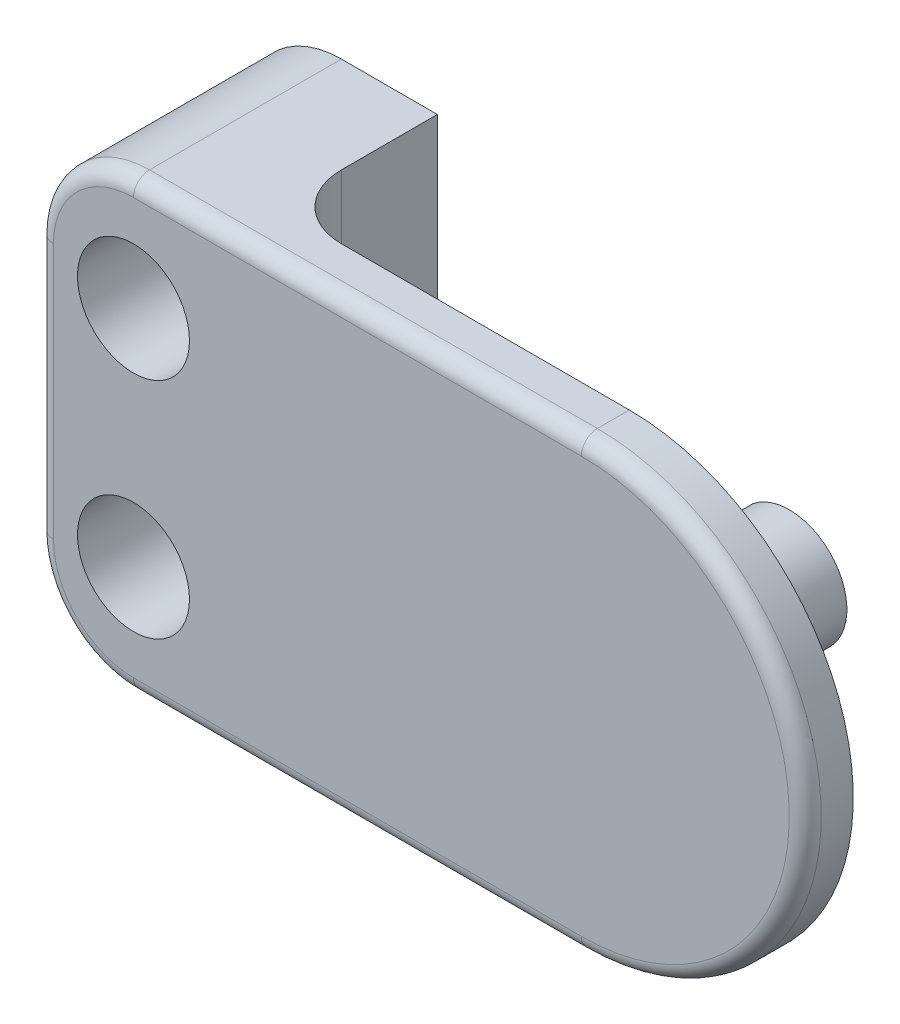
ISO-10303-21;
HEADER;
FILE_DESCRIPTION(('STEP AP214'),'2;1');
FILE_NAME('part.step','',(''),(''),'','','');
FILE_SCHEMA(('AUTOMOTIVE_DESIGN { 1 0 10303 214 1 1 1 1 }'));
ENDSEC;
DATA;
#1=APPLICATION_CONTEXT('core data for automotive mechanical design processes');
#2=APPLICATION_PROTOCOL_DEFINITION('international standard','automotive_design',2000,#1);
#3=PRODUCT_CONTEXT('',#1,'mechanical');
#4=PRODUCT('Part','Part','',(#3));
#5=PRODUCT_RELATED_PRODUCT_CATEGORY('part','',(#4));
#6=PRODUCT_DEFINITION_FORMATION('','',#4);
#7=PRODUCT_DEFINITION_CONTEXT('part definition',#1,'design');
#8=PRODUCT_DEFINITION('design','',#6,#7);
#9=PRODUCT_DEFINITION_SHAPE('','',#8);
#10=(LENGTH_UNIT() NAMED_UNIT(*) SI_UNIT(.MILLI.,.METRE.));
#11=(NAMED_UNIT(*) PLANE_ANGLE_UNIT() SI_UNIT($,.RADIAN.));
#12=(NAMED_UNIT(*) SI_UNIT($,.STERADIAN.) SOLID_ANGLE_UNIT());
#13=UNCERTAINTY_MEASURE_WITH_UNIT(LENGTH_MEASURE(1.E-05),#10,'distance_accuracy_value','');
#14=(GEOMETRIC_REPRESENTATION_CONTEXT(3) GLOBAL_UNCERTAINTY_ASSIGNED_CONTEXT((#13)) GLOBAL_UNIT_ASSIGNED_CONTEXT((#10,
#11,#12)) REPRESENTATION_CONTEXT('',''));
#15=CARTESIAN_POINT('',(0.,0.,0.));
#16=DIRECTION('',(0.,0.,1.));
#17=DIRECTION('',(1.,0.,0.));
#18=AXIS2_PLACEMENT_3D('',#15,#16,#17);
#19=CARTESIAN_POINT('',(-14.,3.5,1.5));
#20=DIRECTION('',(0.,0.,-1.));
#21=DIRECTION('',(-1.,0.,0.));
#22=AXIS2_PLACEMENT_3D('',#19,#20,#21);
#23=CYLINDRICAL_SURFACE('',#22,1.1);
#24=CARTESIAN_POINT('',(-14.,3.5,-5.));
#25=DIRECTION('',(0.,0.,-1.));
#26=DIRECTION('',(-1.,0.,0.));
#27=AXIS2_PLACEMENT_3D('',#24,#25,#26);
#28=CIRCLE('',#27,1.1);
#29=CARTESIAN_POINT('',(-15.1,3.5,-5.));
#30=VERTEX_POINT('',#29);
#31=EDGE_CURVE('E275',#30,#30,#28,.T.);
#32=ORIENTED_EDGE('',*,*,#31,.T.);
#33=EDGE_LOOP('',(#32));
#34=FACE_BOUND('',#33,.T.);
#35=CARTESIAN_POINT('',(-14.,3.5,-2.5));
#36=DIRECTION('',(0.,0.,1.));
#37=DIRECTION('',(1.,0.,0.));
#38=AXIS2_PLACEMENT_3D('',#35,#36,#37);
#39=CIRCLE('',#38,1.1);
#40=CARTESIAN_POINT('',(-12.9,3.5,-2.5));
#41=VERTEX_POINT('',#40);
#42=EDGE_CURVE('E241',#41,#41,#39,.T.);
#43=ORIENTED_EDGE('',*,*,#42,.T.);
#44=EDGE_LOOP('',(#43));
#45=FACE_BOUND('',#44,.T.);
#46=ADVANCED_FACE('F32',(#34,#45),#23,.F.);
#47=CARTESIAN_POINT('',(-14.,-3.5,1.5));
#48=DIRECTION('',(0.,0.,-1.));
#49=DIRECTION('',(-1.,0.,0.));
#50=AXIS2_PLACEMENT_3D('',#47,#48,#49);
#51=CYLINDRICAL_SURFACE('',#50,1.1);
#52=CARTESIAN_POINT('',(-14.,-3.5,-5.));
#53=DIRECTION('',(0.,0.,-1.));
#54=DIRECTION('',(-1.,0.,0.));
#55=AXIS2_PLACEMENT_3D('',#52,#53,#54);
#56=CIRCLE('',#55,1.1);
#57=CARTESIAN_POINT('',(-15.1,-3.5,-5.));
#58=VERTEX_POINT('',#57);
#59=EDGE_CURVE('E255',#58,#58,#56,.T.);
#60=ORIENTED_EDGE('',*,*,#59,.T.);
#61=EDGE_LOOP('',(#60));
#62=FACE_BOUND('',#61,.T.);
#63=CARTESIAN_POINT('',(-14.,-3.5,-2.5));
#64=DIRECTION('',(0.,0.,1.));
#65=DIRECTION('',(1.,0.,0.));
#66=AXIS2_PLACEMENT_3D('',#63,#64,#65);
#67=CIRCLE('',#66,1.1);
#68=CARTESIAN_POINT('',(-12.9,-3.5,-2.5));
#69=VERTEX_POINT('',#68);
#70=EDGE_CURVE('E256',#69,#69,#67,.T.);
#71=ORIENTED_EDGE('',*,*,#70,.T.);
#72=EDGE_LOOP('',(#71));
#73=FACE_BOUND('',#72,.T.);
#74=ADVANCED_FACE('F324',(#62,#73),#51,.F.);
#75=CARTESIAN_POINT('',(0.,0.,0.));
#76=DIRECTION('',(0.,0.,-1.));
#77=DIRECTION('',(-1.,0.,0.));
#78=AXIS2_PLACEMENT_3D('',#75,#76,#77);
#79=PLANE('',#78);
#80=CARTESIAN_POINT('',(0.,0.,0.));
#81=DIRECTION('',(0.,0.,-1.));
#82=DIRECTION('',(-1.,0.,0.));
#83=AXIS2_PLACEMENT_3D('',#80,#81,#82);
#84=CIRCLE('',#83,2.5);
#85=CARTESIAN_POINT('',(-2.5,0.,0.));
#86=VERTEX_POINT('',#85);
#87=EDGE_CURVE('E181',#86,#86,#84,.T.);
#88=ORIENTED_EDGE('',*,*,#87,.F.);
#89=EDGE_LOOP('',(#88));
#90=FACE_BOUND('',#89,.T.);
#91=DIRECTION('',(1.,0.,0.));
#92=VECTOR('',#91,1.);
#93=CARTESIAN_POINT('',(-17.,-7.,0.));
#94=LINE('',#93,#92);
#95=CARTESIAN_POINT('',(-9.,-7.,0.));
#96=VERTEX_POINT('',#95);
#97=CARTESIAN_POINT('',(0.,-7.,0.));
#98=VERTEX_POINT('',#97);
#99=EDGE_CURVE('E192',#96,#98,#94,.T.);
#100=ORIENTED_EDGE('',*,*,#99,.F.);
#101=DIRECTION('',(0.,-1.,0.));
#102=VECTOR('',#101,1.);
#103=CARTESIAN_POINT('',(-9.,0.,0.));
#104=LINE('',#103,#102);
#105=CARTESIAN_POINT('',(-9.,7.,0.));
#106=VERTEX_POINT('',#105);
#107=EDGE_CURVE('E47',#96,#106,#104,.F.);
#108=ORIENTED_EDGE('',*,*,#107,.T.);
#109=DIRECTION('',(-1.,0.,0.));
#110=VECTOR('',#109,1.);
#111=CARTESIAN_POINT('',(-17.,7.,0.));
#112=LINE('',#111,#110);
#113=CARTESIAN_POINT('',(0.,7.,0.));
#114=VERTEX_POINT('',#113);
#115=EDGE_CURVE('E190',#114,#106,#112,.T.);
#116=ORIENTED_EDGE('',*,*,#115,.F.);
#117=CARTESIAN_POINT('',(0.,0.,0.));
#118=DIRECTION('',(0.,0.,1.));
#119=DIRECTION('',(-1.,0.,0.));
#120=AXIS2_PLACEMENT_3D('',#117,#118,#119);
#121=CIRCLE('',#120,7.);
#122=EDGE_CURVE('E185',#98,#114,#121,.T.);
#123=ORIENTED_EDGE('',*,*,#122,.F.);
#124=EDGE_LOOP('',(#100,#108,#116,#123));
#125=FACE_BOUND('',#124,.T.);
#126=ADVANCED_FACE('F314',(#90,#125),#79,.T.);
#127=CARTESIAN_POINT('',(0.,0.,1.5));
#128=DIRECTION('',(0.,0.,-1.));
#129=DIRECTION('',(-1.,0.,0.));
#130=AXIS2_PLACEMENT_3D('',#127,#128,#129);
#131=PLANE('',#130);
#132=CARTESIAN_POINT('',(-14.,3.5,1.5));
#133=DIRECTION('',(0.,0.,1.));
#134=DIRECTION('',(1.,0.,0.));
#135=AXIS2_PLACEMENT_3D('',#132,#133,#134);
#136=CIRCLE('',#135,1.75);
#137=CARTESIAN_POINT('',(-12.25,3.5,1.5));
#138=VERTEX_POINT('',#137);
#139=EDGE_CURVE('E589',#138,#138,#136,.T.);
#140=ORIENTED_EDGE('',*,*,#139,.F.);
#141=EDGE_LOOP('',(#140));
#142=FACE_BOUND('',#141,.T.);
#143=CARTESIAN_POINT('',(-14.,-3.5,1.5));
#144=DIRECTION('',(0.,0.,1.));
#145=DIRECTION('',(1.,0.,0.));
#146=AXIS2_PLACEMENT_3D('',#143,#144,#145);
#147=CIRCLE('',#146,1.75);
#148=CARTESIAN_POINT('',(-12.25,-3.5,1.5));
#149=VERTEX_POINT('',#148);
#150=EDGE_CURVE('E594',#149,#149,#147,.T.);
#151=ORIENTED_EDGE('',*,*,#150,.F.);
#152=EDGE_LOOP('',(#151));
#153=FACE_BOUND('',#152,.T.);
#154=DIRECTION('',(1.,0.,0.));
#155=VECTOR('',#154,1.);
#156=CARTESIAN_POINT('',(0.,-6.5,1.5));
#157=LINE('',#156,#155);
#158=CARTESIAN_POINT('',(-14.,-6.5,1.5));
#159=VERTEX_POINT('',#158);
#160=CARTESIAN_POINT('',(0.,-6.5,1.5));
#161=VERTEX_POINT('',#160);
#162=EDGE_CURVE('E219',#159,#161,#157,.T.);
#163=ORIENTED_EDGE('',*,*,#162,.T.);
#164=CARTESIAN_POINT('',(0.,0.,1.5));
#165=DIRECTION('',(0.,0.,-1.));
#166=DIRECTION('',(-1.,0.,0.));
#167=AXIS2_PLACEMENT_3D('',#164,#165,#166);
#168=CIRCLE('',#167,6.5);
#169=CARTESIAN_POINT('',(0.,6.5,1.5));
#170=VERTEX_POINT('',#169);
#171=EDGE_CURVE('E221',#161,#170,#168,.F.);
#172=ORIENTED_EDGE('',*,*,#171,.T.);
#173=DIRECTION('',(-1.,0.,0.));
#174=VECTOR('',#173,1.);
#175=CARTESIAN_POINT('',(0.,6.5,1.5));
#176=LINE('',#175,#174);
#177=CARTESIAN_POINT('',(-14.,6.5,1.5));
#178=VERTEX_POINT('',#177);
#179=EDGE_CURVE('E211',#170,#178,#176,.T.);
#180=ORIENTED_EDGE('',*,*,#179,.T.);
#181=CARTESIAN_POINT('',(-14.,4.,1.5));
#182=DIRECTION('',(0.,0.,-1.));
#183=DIRECTION('',(-1.,0.,0.));
#184=AXIS2_PLACEMENT_3D('',#181,#182,#183);
#185=CIRCLE('',#184,2.5);
#186=CARTESIAN_POINT('',(-16.5,4.,1.5));
#187=VERTEX_POINT('',#186);
#188=EDGE_CURVE('E213',#178,#187,#185,.F.);
#189=ORIENTED_EDGE('',*,*,#188,.T.);
#190=DIRECTION('',(0.,-1.,0.));
#191=VECTOR('',#190,1.);
#192=CARTESIAN_POINT('',(-16.5,0.,1.5));
#193=LINE('',#192,#191);
#194=CARTESIAN_POINT('',(-16.5,-4.,1.5));
#195=VERTEX_POINT('',#194);
#196=EDGE_CURVE('E215',#187,#195,#193,.T.);
#197=ORIENTED_EDGE('',*,*,#196,.T.);
#198=CARTESIAN_POINT('',(-14.,-4.,1.5));
#199=DIRECTION('',(0.,0.,-1.));
#200=DIRECTION('',(-1.,0.,0.));
#201=AXIS2_PLACEMENT_3D('',#198,#199,#200);
#202=CIRCLE('',#201,2.5);
#203=EDGE_CURVE('E217',#195,#159,#202,.F.);
#204=ORIENTED_EDGE('',*,*,#203,.T.);
#205=EDGE_LOOP('',(#163,#172,#180,#189,#197,#204));
#206=FACE_BOUND('',#205,.T.);
#207=ADVANCED_FACE('F290',(#142,#153,#206),#131,.F.);
#208=CARTESIAN_POINT('',(0.,0.,1.5));
#209=DIRECTION('',(0.,0.,-1.));
#210=DIRECTION('',(-1.,0.,0.));
#211=AXIS2_PLACEMENT_3D('',#208,#209,#210);
#212=CYLINDRICAL_SURFACE('',#211,7.);
#213=DIRECTION('',(0.,0.,-1.));
#214=VECTOR('',#213,1.);
#215=CARTESIAN_POINT('',(0.,7.,1.5));
#216=LINE('',#215,#214);
#217=CARTESIAN_POINT('',(0.,7.,1.));
#218=VERTEX_POINT('',#217);
#219=EDGE_CURVE('E197',#218,#114,#216,.T.);
#220=ORIENTED_EDGE('',*,*,#219,.F.);
#221=CARTESIAN_POINT('',(0.,0.,1.));
#222=DIRECTION('',(0.,0.,-1.));
#223=DIRECTION('',(-1.,0.,0.));
#224=AXIS2_PLACEMENT_3D('',#221,#222,#223);
#225=CIRCLE('',#224,7.);
#226=CARTESIAN_POINT('',(0.,-7.,1.));
#227=VERTEX_POINT('',#226);
#228=EDGE_CURVE('E224',#218,#227,#225,.T.);
#229=ORIENTED_EDGE('',*,*,#228,.T.);
#230=DIRECTION('',(0.,0.,-1.));
#231=VECTOR('',#230,1.);
#232=CARTESIAN_POINT('',(0.,-7.,1.5));
#233=LINE('',#232,#231);
#234=EDGE_CURVE('E194',#227,#98,#233,.T.);
#235=ORIENTED_EDGE('',*,*,#234,.T.);
#236=ORIENTED_EDGE('',*,*,#122,.T.);
#237=EDGE_LOOP('',(#220,#229,#235,#236));
#238=FACE_BOUND('',#237,.T.);
#239=ADVANCED_FACE('F312',(#238),#212,.T.);
#240=CARTESIAN_POINT('',(-17.,7.,1.5));
#241=DIRECTION('',(0.,-1.,0.));
#242=DIRECTION('',(0.,0.,-1.));
#243=AXIS2_PLACEMENT_3D('',#240,#241,#242);
#244=PLANE('',#243);
#245=DIRECTION('',(0.,0.,-1.));
#246=VECTOR('',#245,1.);
#247=CARTESIAN_POINT('',(-14.,7.,1.5));
#248=LINE('',#247,#246);
#249=CARTESIAN_POINT('',(-14.,7.,-5.));
#250=VERTEX_POINT('',#249);
#251=CARTESIAN_POINT('',(-14.,7.,1.));
#252=VERTEX_POINT('',#251);
#253=EDGE_CURVE('E207',#250,#252,#248,.F.);
#254=ORIENTED_EDGE('',*,*,#253,.T.);
#255=DIRECTION('',(-1.,0.,0.));
#256=VECTOR('',#255,1.);
#257=CARTESIAN_POINT('',(-17.,7.,1.));
#258=LINE('',#257,#256);
#259=EDGE_CURVE('E235',#252,#218,#258,.F.);
#260=ORIENTED_EDGE('',*,*,#259,.T.);
#261=ORIENTED_EDGE('',*,*,#219,.T.);
#262=ORIENTED_EDGE('',*,*,#115,.T.);
#263=CARTESIAN_POINT('',(-9.,7.,-2.));
#264=DIRECTION('',(0.,-1.,0.));
#265=DIRECTION('',(0.,0.,-1.));
#266=AXIS2_PLACEMENT_3D('',#263,#264,#265);
#267=CIRCLE('',#266,2.);
#268=CARTESIAN_POINT('',(-11.,7.,-2.));
#269=VERTEX_POINT('',#268);
#270=EDGE_CURVE('E11',#106,#269,#267,.T.);
#271=ORIENTED_EDGE('',*,*,#270,.T.);
#272=DIRECTION('',(0.,0.,1.));
#273=VECTOR('',#272,1.);
#274=CARTESIAN_POINT('',(-11.,7.,-5.));
#275=LINE('',#274,#273);
#276=CARTESIAN_POINT('',(-11.,7.,-5.));
#277=VERTEX_POINT('',#276);
#278=EDGE_CURVE('E148',#277,#269,#275,.T.);
#279=ORIENTED_EDGE('',*,*,#278,.F.);
#280=DIRECTION('',(1.,0.,0.));
#281=VECTOR('',#280,1.);
#282=CARTESIAN_POINT('',(-17.,7.,-5.));
#283=LINE('',#282,#281);
#284=EDGE_CURVE('E131',#250,#277,#283,.T.);
#285=ORIENTED_EDGE('',*,*,#284,.F.);
#286=EDGE_LOOP('',(#254,#260,#261,#262,#271,#279,#285));
#287=FACE_BOUND('',#286,.T.);
#288=ADVANCED_FACE('F149',(#287),#244,.F.);
#289=CARTESIAN_POINT('',(-17.,7.,1.5));
#290=DIRECTION('',(1.,0.,0.));
#291=DIRECTION('',(0.,1.,0.));
#292=AXIS2_PLACEMENT_3D('',#289,#290,#291);
#293=PLANE('',#292);
#294=DIRECTION('',(0.,0.,-1.));
#295=VECTOR('',#294,1.);
#296=CARTESIAN_POINT('',(-17.,-4.,1.5));
#297=LINE('',#296,#295);
#298=CARTESIAN_POINT('',(-17.,-4.,-5.));
#299=VERTEX_POINT('',#298);
#300=CARTESIAN_POINT('',(-17.,-4.,1.));
#301=VERTEX_POINT('',#300);
#302=EDGE_CURVE('E199',#299,#301,#297,.F.);
#303=ORIENTED_EDGE('',*,*,#302,.T.);
#304=DIRECTION('',(0.,-1.,0.));
#305=VECTOR('',#304,1.);
#306=CARTESIAN_POINT('',(-17.,7.,1.));
#307=LINE('',#306,#305);
#308=CARTESIAN_POINT('',(-17.,4.,1.));
#309=VERTEX_POINT('',#308);
#310=EDGE_CURVE('E231',#301,#309,#307,.F.);
#311=ORIENTED_EDGE('',*,*,#310,.T.);
#312=DIRECTION('',(0.,0.,-1.));
#313=VECTOR('',#312,1.);
#314=CARTESIAN_POINT('',(-17.,4.,1.5));
#315=LINE('',#314,#313);
#316=CARTESIAN_POINT('',(-17.,4.,-5.));
#317=VERTEX_POINT('',#316);
#318=EDGE_CURVE('E202',#309,#317,#315,.T.);
#319=ORIENTED_EDGE('',*,*,#318,.T.);
#320=DIRECTION('',(0.,1.,0.));
#321=VECTOR('',#320,1.);
#322=CARTESIAN_POINT('',(-17.,7.,-5.));
#323=LINE('',#322,#321);
#324=EDGE_CURVE('E145',#299,#317,#323,.T.);
#325=ORIENTED_EDGE('',*,*,#324,.F.);
#326=EDGE_LOOP('',(#303,#311,#319,#325));
#327=FACE_BOUND('',#326,.T.);
#328=ADVANCED_FACE('F272',(#327),#293,.F.);
#329=CARTESIAN_POINT('',(-17.,-7.,1.5));
#330=DIRECTION('',(0.,1.,0.));
#331=DIRECTION('',(0.,0.,1.));
#332=AXIS2_PLACEMENT_3D('',#329,#330,#331);
#333=PLANE('',#332);
#334=ORIENTED_EDGE('',*,*,#234,.F.);
#335=DIRECTION('',(1.,0.,0.));
#336=VECTOR('',#335,1.);
#337=CARTESIAN_POINT('',(-17.,-7.,1.));
#338=LINE('',#337,#336);
#339=CARTESIAN_POINT('',(-14.,-7.,1.));
#340=VERTEX_POINT('',#339);
#341=EDGE_CURVE('E227',#227,#340,#338,.F.);
#342=ORIENTED_EDGE('',*,*,#341,.T.);
#343=DIRECTION('',(0.,0.,-1.));
#344=VECTOR('',#343,1.);
#345=CARTESIAN_POINT('',(-14.,-7.,1.5));
#346=LINE('',#345,#344);
#347=CARTESIAN_POINT('',(-14.,-7.,-5.));
#348=VERTEX_POINT('',#347);
#349=EDGE_CURVE('E209',#340,#348,#346,.T.);
#350=ORIENTED_EDGE('',*,*,#349,.T.);
#351=DIRECTION('',(-1.,0.,0.));
#352=VECTOR('',#351,1.);
#353=CARTESIAN_POINT('',(-17.,-7.,-5.));
#354=LINE('',#353,#352);
#355=CARTESIAN_POINT('',(-11.,-7.,-5.));
#356=VERTEX_POINT('',#355);
#357=EDGE_CURVE('E159',#356,#348,#354,.T.);
#358=ORIENTED_EDGE('',*,*,#357,.F.);
#359=DIRECTION('',(0.,0.,1.));
#360=VECTOR('',#359,1.);
#361=CARTESIAN_POINT('',(-11.,-7.,-5.));
#362=LINE('',#361,#360);
#363=CARTESIAN_POINT('',(-11.,-7.,-2.));
#364=VERTEX_POINT('',#363);
#365=EDGE_CURVE('E155',#356,#364,#362,.T.);
#366=ORIENTED_EDGE('',*,*,#365,.T.);
#367=CARTESIAN_POINT('',(-9.,-7.,-2.));
#368=DIRECTION('',(0.,1.,0.));
#369=DIRECTION('',(0.,0.,1.));
#370=AXIS2_PLACEMENT_3D('',#367,#368,#369);
#371=CIRCLE('',#370,2.);
#372=EDGE_CURVE('E40',#364,#96,#371,.T.);
#373=ORIENTED_EDGE('',*,*,#372,.T.);
#374=ORIENTED_EDGE('',*,*,#99,.T.);
#375=EDGE_LOOP('',(#334,#342,#350,#358,#366,#373,#374));
#376=FACE_BOUND('',#375,.T.);
#377=ADVANCED_FACE('F265',(#376),#333,.F.);
#378=CARTESIAN_POINT('',(0.,0.,-1.));
#379=DIRECTION('',(0.,0.,1.));
#380=DIRECTION('',(1.,0.,0.));
#381=AXIS2_PLACEMENT_3D('',#378,#379,#380);
#382=CYLINDRICAL_SURFACE('',#381,2.5);
#383=CARTESIAN_POINT('',(0.,0.,-1.));
#384=DIRECTION('',(0.,0.,-1.));
#385=DIRECTION('',(-1.,0.,0.));
#386=AXIS2_PLACEMENT_3D('',#383,#384,#385);
#387=CIRCLE('',#386,2.5);
#388=CARTESIAN_POINT('',(-2.5,0.,-1.));
#389=VERTEX_POINT('',#388);
#390=EDGE_CURVE('E182',#389,#389,#387,.T.);
#391=ORIENTED_EDGE('',*,*,#390,.F.);
#392=EDGE_LOOP('',(#391));
#393=FACE_BOUND('',#392,.T.);
#394=ORIENTED_EDGE('',*,*,#87,.T.);
#395=EDGE_LOOP('',(#394));
#396=FACE_BOUND('',#395,.T.);
#397=ADVANCED_FACE('F344',(#393,#396),#382,.T.);
#398=CARTESIAN_POINT('',(0.,0.,-1.));
#399=DIRECTION('',(0.,0.,-1.));
#400=DIRECTION('',(-1.,0.,0.));
#401=AXIS2_PLACEMENT_3D('',#398,#399,#400);
#402=PLANE('',#401);
#403=CARTESIAN_POINT('',(0.,0.,-1.));
#404=DIRECTION('',(0.,0.,-1.));
#405=DIRECTION('',(-1.,0.,0.));
#406=AXIS2_PLACEMENT_3D('',#403,#404,#405);
#407=CIRCLE('',#406,1.8);
#408=CARTESIAN_POINT('',(-1.13862177025649,1.39410920099466,-1.));
#409=VERTEX_POINT('',#408);
#410=CARTESIAN_POINT('',(-1.13862177025649,-1.39410920099466,-1.));
#411=VERTEX_POINT('',#410);
#412=EDGE_CURVE('E154',#409,#411,#407,.T.);
#413=ORIENTED_EDGE('',*,*,#412,.F.);
#414=DIRECTION('',(0.,1.,0.));
#415=VECTOR('',#414,1.);
#416=CARTESIAN_POINT('',(-1.13862177025649,1.39410920099466,-1.));
#417=LINE('',#416,#415);
#418=EDGE_CURVE('E169',#411,#409,#417,.T.);
#419=ORIENTED_EDGE('',*,*,#418,.F.);
#420=EDGE_LOOP('',(#413,#419));
#421=FACE_BOUND('',#420,.T.);
#422=ORIENTED_EDGE('',*,*,#390,.T.);
#423=EDGE_LOOP('',(#422));
#424=FACE_BOUND('',#423,.T.);
#425=ADVANCED_FACE('F546',(#421,#424),#402,.T.);
#426=CARTESIAN_POINT('',(0.,0.,-5.));
#427=DIRECTION('',(0.,0.,1.));
#428=DIRECTION('',(1.,0.,0.));
#429=AXIS2_PLACEMENT_3D('',#426,#427,#428);
#430=CYLINDRICAL_SURFACE('',#429,1.8);
#431=ORIENTED_EDGE('',*,*,#412,.T.);
#432=DIRECTION('',(0.,0.,1.));
#433=VECTOR('',#432,1.);
#434=CARTESIAN_POINT('',(-1.13862177025649,-1.39410920099466,-5.));
#435=LINE('',#434,#433);
#436=CARTESIAN_POINT('',(-1.13862177025649,-1.39410920099466,-5.));
#437=VERTEX_POINT('',#436);
#438=EDGE_CURVE('E178',#437,#411,#435,.T.);
#439=ORIENTED_EDGE('',*,*,#438,.F.);
#440=CARTESIAN_POINT('',(0.,0.,-5.));
#441=DIRECTION('',(0.,0.,-1.));
#442=DIRECTION('',(-1.,0.,0.));
#443=AXIS2_PLACEMENT_3D('',#440,#441,#442);
#444=CIRCLE('',#443,1.8);
#445=CARTESIAN_POINT('',(-1.13862177025649,1.39410920099466,-5.));
#446=VERTEX_POINT('',#445);
#447=EDGE_CURVE('E165',#446,#437,#444,.T.);
#448=ORIENTED_EDGE('',*,*,#447,.F.);
#449=DIRECTION('',(0.,0.,1.));
#450=VECTOR('',#449,1.);
#451=CARTESIAN_POINT('',(-1.13862177025649,1.39410920099466,-5.));
#452=LINE('',#451,#450);
#453=EDGE_CURVE('E171',#446,#409,#452,.T.);
#454=ORIENTED_EDGE('',*,*,#453,.T.);
#455=EDGE_LOOP('',(#431,#439,#448,#454));
#456=FACE_BOUND('',#455,.T.);
#457=ADVANCED_FACE('F536',(#456),#430,.T.);
#458=CARTESIAN_POINT('',(-1.13862177025649,1.39410920099466,-5.));
#459=DIRECTION('',(1.,0.,0.));
#460=DIRECTION('',(0.,0.,-1.));
#461=AXIS2_PLACEMENT_3D('',#458,#459,#460);
#462=PLANE('',#461);
#463=ORIENTED_EDGE('',*,*,#418,.T.);
#464=ORIENTED_EDGE('',*,*,#453,.F.);
#465=DIRECTION('',(0.,1.,0.));
#466=VECTOR('',#465,1.);
#467=CARTESIAN_POINT('',(-1.13862177025649,1.39410920099466,-5.));
#468=LINE('',#467,#466);
#469=EDGE_CURVE('E168',#437,#446,#468,.T.);
#470=ORIENTED_EDGE('',*,*,#469,.F.);
#471=ORIENTED_EDGE('',*,*,#438,.T.);
#472=EDGE_LOOP('',(#463,#464,#470,#471));
#473=FACE_BOUND('',#472,.T.);
#474=ADVANCED_FACE('F526',(#473),#462,.F.);
#475=CARTESIAN_POINT('',(0.,0.,-5.));
#476=DIRECTION('',(0.,0.,-1.));
#477=DIRECTION('',(-1.,0.,0.));
#478=AXIS2_PLACEMENT_3D('',#475,#476,#477);
#479=PLANE('',#478);
#480=ORIENTED_EDGE('',*,*,#447,.T.);
#481=ORIENTED_EDGE('',*,*,#469,.T.);
#482=EDGE_LOOP('',(#480,#481));
#483=FACE_BOUND('',#482,.T.);
#484=ADVANCED_FACE('F520',(#483),#479,.T.);
#485=CARTESIAN_POINT('',(0.,0.,-5.));
#486=DIRECTION('',(0.,0.,1.));
#487=DIRECTION('',(1.,0.,0.));
#488=AXIS2_PLACEMENT_3D('',#485,#486,#487);
#489=PLANE('',#488);
#490=ORIENTED_EDGE('',*,*,#324,.T.);
#491=CARTESIAN_POINT('',(-14.,4.,-5.));
#492=DIRECTION('',(0.,0.,1.));
#493=DIRECTION('',(1.,0.,0.));
#494=AXIS2_PLACEMENT_3D('',#491,#492,#493);
#495=CIRCLE('',#494,3.);
#496=EDGE_CURVE('E141',#317,#250,#495,.F.);
#497=ORIENTED_EDGE('',*,*,#496,.T.);
#498=ORIENTED_EDGE('',*,*,#284,.T.);
#499=DIRECTION('',(0.,-1.,0.));
#500=VECTOR('',#499,1.);
#501=CARTESIAN_POINT('',(-11.,7.,-5.));
#502=LINE('',#501,#500);
#503=EDGE_CURVE('E138',#277,#356,#502,.T.);
#504=ORIENTED_EDGE('',*,*,#503,.T.);
#505=ORIENTED_EDGE('',*,*,#357,.T.);
#506=CARTESIAN_POINT('',(-14.,-4.,-5.));
#507=DIRECTION('',(0.,0.,1.));
#508=DIRECTION('',(1.,0.,0.));
#509=AXIS2_PLACEMENT_3D('',#506,#507,#508);
#510=CIRCLE('',#509,3.);
#511=EDGE_CURVE('E204',#348,#299,#510,.F.);
#512=ORIENTED_EDGE('',*,*,#511,.T.);
#513=EDGE_LOOP('',(#490,#497,#498,#504,#505,#512));
#514=FACE_BOUND('',#513,.T.);
#515=ORIENTED_EDGE('',*,*,#31,.F.);
#516=EDGE_LOOP('',(#515));
#517=FACE_BOUND('',#516,.T.);
#518=ORIENTED_EDGE('',*,*,#59,.F.);
#519=EDGE_LOOP('',(#518));
#520=FACE_BOUND('',#519,.T.);
#521=ADVANCED_FACE('F134',(#514,#517,#520),#489,.F.);
#522=CARTESIAN_POINT('',(-11.,7.,-5.));
#523=DIRECTION('',(-1.,0.,0.));
#524=DIRECTION('',(0.,-1.,0.));
#525=AXIS2_PLACEMENT_3D('',#522,#523,#524);
#526=PLANE('',#525);
#527=ORIENTED_EDGE('',*,*,#278,.T.);
#528=DIRECTION('',(0.,-1.,0.));
#529=VECTOR('',#528,1.);
#530=CARTESIAN_POINT('',(-11.,7.,-2.));
#531=LINE('',#530,#529);
#532=EDGE_CURVE('E237',#269,#364,#531,.T.);
#533=ORIENTED_EDGE('',*,*,#532,.T.);
#534=ORIENTED_EDGE('',*,*,#365,.F.);
#535=ORIENTED_EDGE('',*,*,#503,.F.);
#536=EDGE_LOOP('',(#527,#533,#534,#535));
#537=FACE_BOUND('',#536,.T.);
#538=ADVANCED_FACE('F157',(#537),#526,.F.);
#539=CARTESIAN_POINT('',(-14.,4.,1.5));
#540=DIRECTION('',(0.,0.,-1.));
#541=DIRECTION('',(-1.,0.,0.));
#542=AXIS2_PLACEMENT_3D('',#539,#540,#541);
#543=CYLINDRICAL_SURFACE('',#542,3.);
#544=ORIENTED_EDGE('',*,*,#318,.F.);
#545=CARTESIAN_POINT('',(-14.,4.,1.));
#546=DIRECTION('',(0.,0.,-1.));
#547=DIRECTION('',(-1.,0.,0.));
#548=AXIS2_PLACEMENT_3D('',#545,#546,#547);
#549=CIRCLE('',#548,3.);
#550=EDGE_CURVE('E233',#309,#252,#549,.T.);
#551=ORIENTED_EDGE('',*,*,#550,.T.);
#552=ORIENTED_EDGE('',*,*,#253,.F.);
#553=ORIENTED_EDGE('',*,*,#496,.F.);
#554=EDGE_LOOP('',(#544,#551,#552,#553));
#555=FACE_BOUND('',#554,.T.);
#556=ADVANCED_FACE('F298',(#555),#543,.T.);
#557=CARTESIAN_POINT('',(-14.,-4.,1.5));
#558=DIRECTION('',(0.,0.,-1.));
#559=DIRECTION('',(-1.,0.,0.));
#560=AXIS2_PLACEMENT_3D('',#557,#558,#559);
#561=CYLINDRICAL_SURFACE('',#560,3.);
#562=ORIENTED_EDGE('',*,*,#349,.F.);
#563=CARTESIAN_POINT('',(-14.,-4.,1.));
#564=DIRECTION('',(0.,0.,-1.));
#565=DIRECTION('',(-1.,0.,0.));
#566=AXIS2_PLACEMENT_3D('',#563,#564,#565);
#567=CIRCLE('',#566,3.);
#568=EDGE_CURVE('E229',#340,#301,#567,.T.);
#569=ORIENTED_EDGE('',*,*,#568,.T.);
#570=ORIENTED_EDGE('',*,*,#302,.F.);
#571=ORIENTED_EDGE('',*,*,#511,.F.);
#572=EDGE_LOOP('',(#562,#569,#570,#571));
#573=FACE_BOUND('',#572,.T.);
#574=ADVANCED_FACE('F276',(#573),#561,.T.);
#575=CARTESIAN_POINT('',(-16.5,0.,1.));
#576=DIRECTION('',(0.,-1.,0.));
#577=DIRECTION('',(1.,0.,0.));
#578=AXIS2_PLACEMENT_3D('',#575,#576,#577);
#579=CYLINDRICAL_SURFACE('',#578,0.5);
#580=CARTESIAN_POINT('',(-16.5,4.,1.));
#581=DIRECTION('',(0.,1.,0.));
#582=DIRECTION('',(0.,0.,1.));
#583=AXIS2_PLACEMENT_3D('',#580,#581,#582);
#584=CIRCLE('',#583,0.5);
#585=EDGE_CURVE('E249',#309,#187,#584,.T.);
#586=ORIENTED_EDGE('',*,*,#585,.F.);
#587=ORIENTED_EDGE('',*,*,#310,.F.);
#588=CARTESIAN_POINT('',(-16.5,-4.,1.));
#589=DIRECTION('',(0.,-1.,0.));
#590=DIRECTION('',(0.,0.,-1.));
#591=AXIS2_PLACEMENT_3D('',#588,#589,#590);
#592=CIRCLE('',#591,0.5);
#593=EDGE_CURVE('E252',#195,#301,#592,.T.);
#594=ORIENTED_EDGE('',*,*,#593,.F.);
#595=ORIENTED_EDGE('',*,*,#196,.F.);
#596=EDGE_LOOP('',(#586,#587,#594,#595));
#597=FACE_BOUND('',#596,.T.);
#598=ADVANCED_FACE('F295',(#597),#579,.T.);
#599=CARTESIAN_POINT('',(-14.,-4.,1.));
#600=DIRECTION('',(0.,0.,-1.));
#601=DIRECTION('',(-1.,0.,0.));
#602=AXIS2_PLACEMENT_3D('',#599,#600,#601);
#603=TOROIDAL_SURFACE('',#602,2.5,0.5);
#604=ORIENTED_EDGE('',*,*,#593,.T.);
#605=ORIENTED_EDGE('',*,*,#568,.F.);
#606=CARTESIAN_POINT('',(-14.,-6.5,1.));
#607=DIRECTION('',(1.,0.,0.));
#608=DIRECTION('',(0.,0.,-1.));
#609=AXIS2_PLACEMENT_3D('',#606,#607,#608);
#610=CIRCLE('',#609,0.5);
#611=EDGE_CURVE('E246',#159,#340,#610,.T.);
#612=ORIENTED_EDGE('',*,*,#611,.F.);
#613=ORIENTED_EDGE('',*,*,#203,.F.);
#614=EDGE_LOOP('',(#604,#605,#612,#613));
#615=FACE_BOUND('',#614,.T.);
#616=ADVANCED_FACE('F280',(#615),#603,.T.);
#617=CARTESIAN_POINT('',(-14.,4.,1.));
#618=DIRECTION('',(0.,0.,-1.));
#619=DIRECTION('',(-1.,0.,0.));
#620=AXIS2_PLACEMENT_3D('',#617,#618,#619);
#621=TOROIDAL_SURFACE('',#620,2.5,0.5);
#622=ORIENTED_EDGE('',*,*,#585,.T.);
#623=ORIENTED_EDGE('',*,*,#188,.F.);
#624=CARTESIAN_POINT('',(-14.,6.5,1.));
#625=DIRECTION('',(1.,0.,0.));
#626=DIRECTION('',(0.,0.,-1.));
#627=AXIS2_PLACEMENT_3D('',#624,#625,#626);
#628=CIRCLE('',#627,0.5);
#629=EDGE_CURVE('E243',#252,#178,#628,.T.);
#630=ORIENTED_EDGE('',*,*,#629,.F.);
#631=ORIENTED_EDGE('',*,*,#550,.F.);
#632=EDGE_LOOP('',(#622,#623,#630,#631));
#633=FACE_BOUND('',#632,.T.);
#634=ADVANCED_FACE('F303',(#633),#621,.T.);
#635=CARTESIAN_POINT('',(0.,-6.5,1.));
#636=DIRECTION('',(1.,0.,0.));
#637=DIRECTION('',(0.,0.,-1.));
#638=AXIS2_PLACEMENT_3D('',#635,#636,#637);
#639=CYLINDRICAL_SURFACE('',#638,0.5);
#640=ORIENTED_EDGE('',*,*,#611,.T.);
#641=ORIENTED_EDGE('',*,*,#341,.F.);
#642=CARTESIAN_POINT('',(0.,-6.5,1.));
#643=DIRECTION('',(1.,0.,0.));
#644=DIRECTION('',(0.,0.,-1.));
#645=AXIS2_PLACEMENT_3D('',#642,#643,#644);
#646=CIRCLE('',#645,0.5);
#647=EDGE_CURVE('E240',#161,#227,#646,.T.);
#648=ORIENTED_EDGE('',*,*,#647,.F.);
#649=ORIENTED_EDGE('',*,*,#162,.F.);
#650=EDGE_LOOP('',(#640,#641,#648,#649));
#651=FACE_BOUND('',#650,.T.);
#652=ADVANCED_FACE('F286',(#651),#639,.T.);
#653=CARTESIAN_POINT('',(0.,6.5,1.));
#654=DIRECTION('',(-1.,0.,0.));
#655=DIRECTION('',(0.,0.,1.));
#656=AXIS2_PLACEMENT_3D('',#653,#654,#655);
#657=CYLINDRICAL_SURFACE('',#656,0.5);
#658=ORIENTED_EDGE('',*,*,#629,.T.);
#659=ORIENTED_EDGE('',*,*,#179,.F.);
#660=CARTESIAN_POINT('',(0.,6.5,1.));
#661=DIRECTION('',(1.,0.,0.));
#662=DIRECTION('',(0.,0.,-1.));
#663=AXIS2_PLACEMENT_3D('',#660,#661,#662);
#664=CIRCLE('',#663,0.5);
#665=EDGE_CURVE('E238',#218,#170,#664,.T.);
#666=ORIENTED_EDGE('',*,*,#665,.F.);
#667=ORIENTED_EDGE('',*,*,#259,.F.);
#668=EDGE_LOOP('',(#658,#659,#666,#667));
#669=FACE_BOUND('',#668,.T.);
#670=ADVANCED_FACE('F307',(#669),#657,.T.);
#671=CARTESIAN_POINT('',(0.,0.,1.));
#672=DIRECTION('',(0.,0.,-1.));
#673=DIRECTION('',(-1.,0.,0.));
#674=AXIS2_PLACEMENT_3D('',#671,#672,#673);
#675=TOROIDAL_SURFACE('',#674,6.5,0.5);
#676=ORIENTED_EDGE('',*,*,#647,.T.);
#677=ORIENTED_EDGE('',*,*,#228,.F.);
#678=ORIENTED_EDGE('',*,*,#665,.T.);
#679=ORIENTED_EDGE('',*,*,#171,.F.);
#680=EDGE_LOOP('',(#676,#677,#678,#679));
#681=FACE_BOUND('',#680,.T.);
#682=ADVANCED_FACE('F310',(#681),#675,.T.);
#683=CARTESIAN_POINT('',(-14.,-3.5,-2.5));
#684=DIRECTION('',(0.,0.,1.));
#685=DIRECTION('',(1.,0.,0.));
#686=AXIS2_PLACEMENT_3D('',#683,#684,#685);
#687=CYLINDRICAL_SURFACE('',#686,1.75);
#688=CARTESIAN_POINT('',(-14.,-3.5,-2.5));
#689=DIRECTION('',(0.,0.,1.));
#690=DIRECTION('',(1.,0.,0.));
#691=AXIS2_PLACEMENT_3D('',#688,#689,#690);
#692=CIRCLE('',#691,1.75);
#693=CARTESIAN_POINT('',(-12.25,-3.5,-2.5));
#694=VERTEX_POINT('',#693);
#695=EDGE_CURVE('E590',#694,#694,#692,.T.);
#696=ORIENTED_EDGE('',*,*,#695,.F.);
#697=EDGE_LOOP('',(#696));
#698=FACE_BOUND('',#697,.T.);
#699=ORIENTED_EDGE('',*,*,#150,.T.);
#700=EDGE_LOOP('',(#699));
#701=FACE_BOUND('',#700,.T.);
#702=ADVANCED_FACE('F357',(#698,#701),#687,.F.);
#703=CARTESIAN_POINT('',(-14.,-3.5,-2.5));
#704=DIRECTION('',(0.,0.,1.));
#705=DIRECTION('',(1.,0.,0.));
#706=AXIS2_PLACEMENT_3D('',#703,#704,#705);
#707=PLANE('',#706);
#708=ORIENTED_EDGE('',*,*,#70,.F.);
#709=EDGE_LOOP('',(#708));
#710=FACE_BOUND('',#709,.T.);
#711=ORIENTED_EDGE('',*,*,#695,.T.);
#712=EDGE_LOOP('',(#711));
#713=FACE_BOUND('',#712,.T.);
#714=ADVANCED_FACE('F396',(#710,#713),#707,.T.);
#715=CARTESIAN_POINT('',(-14.,3.5,-2.5));
#716=DIRECTION('',(0.,0.,1.));
#717=DIRECTION('',(1.,0.,0.));
#718=AXIS2_PLACEMENT_3D('',#715,#716,#717);
#719=CYLINDRICAL_SURFACE('',#718,1.75);
#720=CARTESIAN_POINT('',(-14.,3.5,-2.5));
#721=DIRECTION('',(0.,0.,1.));
#722=DIRECTION('',(1.,0.,0.));
#723=AXIS2_PLACEMENT_3D('',#720,#721,#722);
#724=CIRCLE('',#723,1.75);
#725=CARTESIAN_POINT('',(-12.25,3.5,-2.5));
#726=VERTEX_POINT('',#725);
#727=EDGE_CURVE('E259',#726,#726,#724,.T.);
#728=ORIENTED_EDGE('',*,*,#727,.F.);
#729=EDGE_LOOP('',(#728));
#730=FACE_BOUND('',#729,.T.);
#731=ORIENTED_EDGE('',*,*,#139,.T.);
#732=EDGE_LOOP('',(#731));
#733=FACE_BOUND('',#732,.T.);
#734=ADVANCED_FACE('F320',(#730,#733),#719,.F.);
#735=CARTESIAN_POINT('',(-14.,3.5,-2.5));
#736=DIRECTION('',(0.,0.,1.));
#737=DIRECTION('',(1.,0.,0.));
#738=AXIS2_PLACEMENT_3D('',#735,#736,#737);
#739=PLANE('',#738);
#740=ORIENTED_EDGE('',*,*,#42,.F.);
#741=EDGE_LOOP('',(#740));
#742=FACE_BOUND('',#741,.T.);
#743=ORIENTED_EDGE('',*,*,#727,.T.);
#744=EDGE_LOOP('',(#743));
#745=FACE_BOUND('',#744,.T.);
#746=ADVANCED_FACE('F316',(#742,#745),#739,.T.);
#747=CARTESIAN_POINT('',(-9.,7.,-2.));
#748=DIRECTION('',(0.,-1.,0.));
#749=DIRECTION('',(1.,0.,0.));
#750=AXIS2_PLACEMENT_3D('',#747,#748,#749);
#751=CYLINDRICAL_SURFACE('',#750,2.);
#752=ORIENTED_EDGE('',*,*,#270,.F.);
#753=ORIENTED_EDGE('',*,*,#107,.F.);
#754=ORIENTED_EDGE('',*,*,#372,.F.);
#755=ORIENTED_EDGE('',*,*,#532,.F.);
#756=EDGE_LOOP('',(#752,#753,#754,#755));
#757=FACE_BOUND('',#756,.T.);
#758=ADVANCED_FACE('F34',(#757),#751,.F.);
#759=CLOSED_SHELL('',(#46,#74,#126,#207,#239,#288,#328,#377,#397,#425,#457,#474,#484,#521,#538,
#556,#574,#598,#616,#634,#652,#670,#682,#702,#714,#734,#746,#758));
#760=MANIFOLD_SOLID_BREP('B2',#759);
#761=ADVANCED_BREP_SHAPE_REPRESENTATION('',(#18,#760),#14);
#762=SHAPE_DEFINITION_REPRESENTATION(#9,#761);
ENDSEC;
END-ISO-10303-21;
